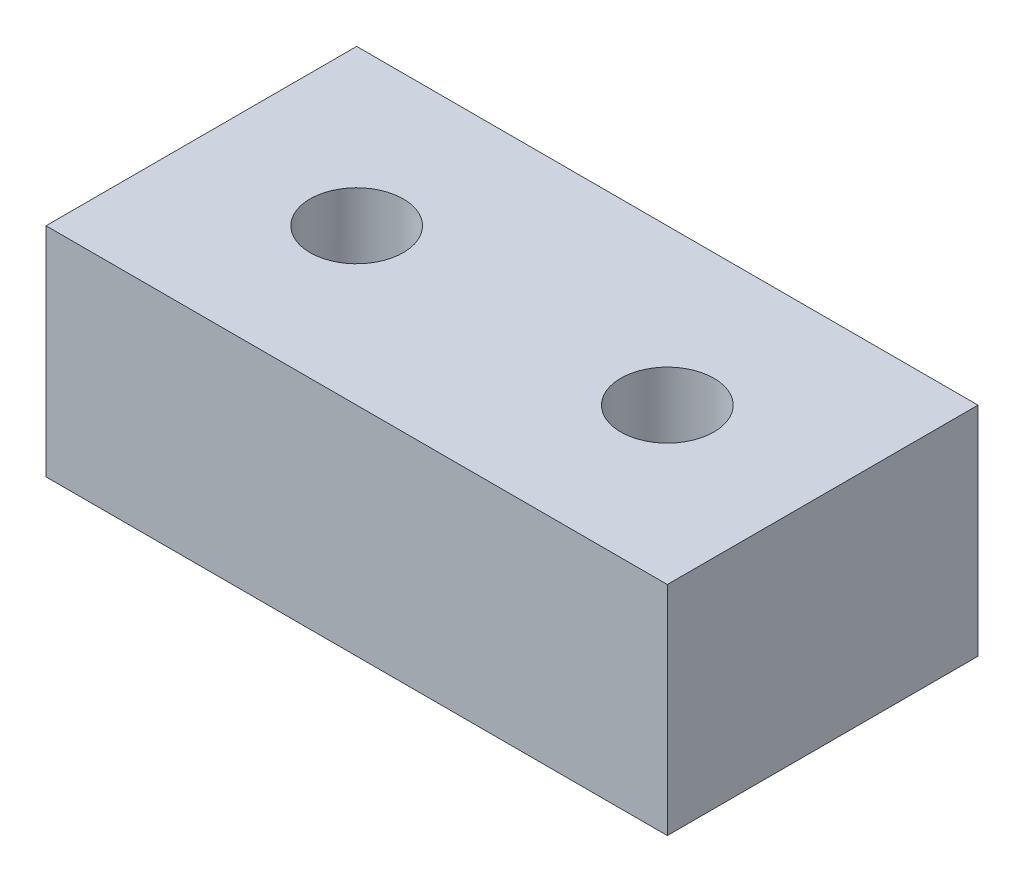
ISO-10303-21;
HEADER;
FILE_DESCRIPTION(('STEP AP214'),'2;1');
FILE_NAME('part.step','',(''),(''),'','','');
FILE_SCHEMA(('AUTOMOTIVE_DESIGN { 1 0 10303 214 1 1 1 1 }'));
ENDSEC;
DATA;
#1=APPLICATION_CONTEXT('core data for automotive mechanical design processes');
#2=APPLICATION_PROTOCOL_DEFINITION('international standard','automotive_design',2000,#1);
#3=PRODUCT_CONTEXT('',#1,'mechanical');
#4=PRODUCT('Part','Part','',(#3));
#5=PRODUCT_RELATED_PRODUCT_CATEGORY('part','',(#4));
#6=PRODUCT_DEFINITION_FORMATION('','',#4);
#7=PRODUCT_DEFINITION_CONTEXT('part definition',#1,'design');
#8=PRODUCT_DEFINITION('design','',#6,#7);
#9=PRODUCT_DEFINITION_SHAPE('','',#8);
#10=(LENGTH_UNIT() NAMED_UNIT(*) SI_UNIT(.MILLI.,.METRE.));
#11=(NAMED_UNIT(*) PLANE_ANGLE_UNIT() SI_UNIT($,.RADIAN.));
#12=(NAMED_UNIT(*) SI_UNIT($,.STERADIAN.) SOLID_ANGLE_UNIT());
#13=UNCERTAINTY_MEASURE_WITH_UNIT(LENGTH_MEASURE(1.E-05),#10,'distance_accuracy_value','');
#14=(GEOMETRIC_REPRESENTATION_CONTEXT(3) GLOBAL_UNCERTAINTY_ASSIGNED_CONTEXT((#13)) GLOBAL_UNIT_ASSIGNED_CONTEXT((#10,
#11,#12)) REPRESENTATION_CONTEXT('',''));
#15=CARTESIAN_POINT('',(0.,0.,0.));
#16=DIRECTION('',(0.,0.,1.));
#17=DIRECTION('',(1.,0.,0.));
#18=AXIS2_PLACEMENT_3D('',#15,#16,#17);
#19=CARTESIAN_POINT('',(10.,7.,5.));
#20=DIRECTION('',(-1.,0.,0.));
#21=DIRECTION('',(0.,0.,1.));
#22=AXIS2_PLACEMENT_3D('',#19,#20,#21);
#23=PLANE('',#22);
#24=DIRECTION('',(0.,0.,-1.));
#25=VECTOR('',#24,1.);
#26=CARTESIAN_POINT('',(10.,0.,5.));
#27=LINE('',#26,#25);
#28=CARTESIAN_POINT('',(10.,0.,5.));
#29=VERTEX_POINT('',#28);
#30=CARTESIAN_POINT('',(10.,0.,-5.));
#31=VERTEX_POINT('',#30);
#32=EDGE_CURVE('E108',#29,#31,#27,.T.);
#33=ORIENTED_EDGE('',*,*,#32,.T.);
#34=DIRECTION('',(0.,-1.,0.));
#35=VECTOR('',#34,1.);
#36=CARTESIAN_POINT('',(10.,7.,-5.));
#37=LINE('',#36,#35);
#38=CARTESIAN_POINT('',(10.,7.,-5.));
#39=VERTEX_POINT('',#38);
#40=EDGE_CURVE('E11',#39,#31,#37,.T.);
#41=ORIENTED_EDGE('',*,*,#40,.F.);
#42=DIRECTION('',(0.,0.,-1.));
#43=VECTOR('',#42,1.);
#44=CARTESIAN_POINT('',(10.,7.,5.));
#45=LINE('',#44,#43);
#46=CARTESIAN_POINT('',(10.,7.,5.));
#47=VERTEX_POINT('',#46);
#48=EDGE_CURVE('E95',#47,#39,#45,.T.);
#49=ORIENTED_EDGE('',*,*,#48,.F.);
#50=DIRECTION('',(0.,-1.,0.));
#51=VECTOR('',#50,1.);
#52=CARTESIAN_POINT('',(10.,7.,5.));
#53=LINE('',#52,#51);
#54=EDGE_CURVE('E104',#47,#29,#53,.T.);
#55=ORIENTED_EDGE('',*,*,#54,.T.);
#56=EDGE_LOOP('',(#33,#41,#49,#55));
#57=FACE_BOUND('',#56,.T.);
#58=ADVANCED_FACE('F42',(#57),#23,.F.);
#59=CARTESIAN_POINT('',(-10.,7.,-5.));
#60=DIRECTION('',(0.,0.,1.));
#61=DIRECTION('',(1.,0.,0.));
#62=AXIS2_PLACEMENT_3D('',#59,#60,#61);
#63=PLANE('',#62);
#64=DIRECTION('',(-1.,0.,0.));
#65=VECTOR('',#64,1.);
#66=CARTESIAN_POINT('',(-10.,0.,-5.));
#67=LINE('',#66,#65);
#68=CARTESIAN_POINT('',(-10.,0.,-5.));
#69=VERTEX_POINT('',#68);
#70=EDGE_CURVE('E99',#31,#69,#67,.T.);
#71=ORIENTED_EDGE('',*,*,#70,.T.);
#72=DIRECTION('',(0.,-1.,0.));
#73=VECTOR('',#72,1.);
#74=CARTESIAN_POINT('',(-10.,7.,-5.));
#75=LINE('',#74,#73);
#76=CARTESIAN_POINT('',(-10.,7.,-5.));
#77=VERTEX_POINT('',#76);
#78=EDGE_CURVE('E51',#77,#69,#75,.T.);
#79=ORIENTED_EDGE('',*,*,#78,.F.);
#80=DIRECTION('',(-1.,0.,0.));
#81=VECTOR('',#80,1.);
#82=CARTESIAN_POINT('',(-10.,7.,-5.));
#83=LINE('',#82,#81);
#84=EDGE_CURVE('E90',#39,#77,#83,.T.);
#85=ORIENTED_EDGE('',*,*,#84,.F.);
#86=ORIENTED_EDGE('',*,*,#40,.T.);
#87=EDGE_LOOP('',(#71,#79,#85,#86));
#88=FACE_BOUND('',#87,.T.);
#89=ADVANCED_FACE('F98',(#88),#63,.F.);
#90=CARTESIAN_POINT('',(-10.,7.,5.));
#91=DIRECTION('',(1.,0.,0.));
#92=DIRECTION('',(0.,0.,-1.));
#93=AXIS2_PLACEMENT_3D('',#90,#91,#92);
#94=PLANE('',#93);
#95=DIRECTION('',(0.,0.,1.));
#96=VECTOR('',#95,1.);
#97=CARTESIAN_POINT('',(-10.,0.,5.));
#98=LINE('',#97,#96);
#99=CARTESIAN_POINT('',(-10.,0.,5.));
#100=VERTEX_POINT('',#99);
#101=EDGE_CURVE('E77',#69,#100,#98,.T.);
#102=ORIENTED_EDGE('',*,*,#101,.T.);
#103=DIRECTION('',(0.,-1.,0.));
#104=VECTOR('',#103,1.);
#105=CARTESIAN_POINT('',(-10.,7.,5.));
#106=LINE('',#105,#104);
#107=CARTESIAN_POINT('',(-10.,7.,5.));
#108=VERTEX_POINT('',#107);
#109=EDGE_CURVE('E100',#108,#100,#106,.T.);
#110=ORIENTED_EDGE('',*,*,#109,.F.);
#111=DIRECTION('',(0.,0.,1.));
#112=VECTOR('',#111,1.);
#113=CARTESIAN_POINT('',(-10.,7.,5.));
#114=LINE('',#113,#112);
#115=EDGE_CURVE('E93',#77,#108,#114,.T.);
#116=ORIENTED_EDGE('',*,*,#115,.F.);
#117=ORIENTED_EDGE('',*,*,#78,.T.);
#118=EDGE_LOOP('',(#102,#110,#116,#117));
#119=FACE_BOUND('',#118,.T.);
#120=ADVANCED_FACE('F102',(#119),#94,.F.);
#121=CARTESIAN_POINT('',(-10.,7.,5.));
#122=DIRECTION('',(0.,0.,-1.));
#123=DIRECTION('',(-1.,0.,0.));
#124=AXIS2_PLACEMENT_3D('',#121,#122,#123);
#125=PLANE('',#124);
#126=DIRECTION('',(1.,0.,0.));
#127=VECTOR('',#126,1.);
#128=CARTESIAN_POINT('',(-10.,0.,5.));
#129=LINE('',#128,#127);
#130=EDGE_CURVE('E83',#100,#29,#129,.T.);
#131=ORIENTED_EDGE('',*,*,#130,.T.);
#132=ORIENTED_EDGE('',*,*,#54,.F.);
#133=DIRECTION('',(1.,0.,0.));
#134=VECTOR('',#133,1.);
#135=CARTESIAN_POINT('',(-10.,7.,5.));
#136=LINE('',#135,#134);
#137=EDGE_CURVE('E60',#108,#47,#136,.T.);
#138=ORIENTED_EDGE('',*,*,#137,.F.);
#139=ORIENTED_EDGE('',*,*,#109,.T.);
#140=EDGE_LOOP('',(#131,#132,#138,#139));
#141=FACE_BOUND('',#140,.T.);
#142=ADVANCED_FACE('F134',(#141),#125,.F.);
#143=CARTESIAN_POINT('',(0.,7.,0.));
#144=DIRECTION('',(0.,-1.,0.));
#145=DIRECTION('',(0.,0.,-1.));
#146=AXIS2_PLACEMENT_3D('',#143,#144,#145);
#147=PLANE('',#146);
#148=CARTESIAN_POINT('',(-5.,7.,0.));
#149=DIRECTION('',(0.,1.,0.));
#150=DIRECTION('',(0.,0.,1.));
#151=AXIS2_PLACEMENT_3D('',#148,#149,#150);
#152=CIRCLE('',#151,1.5);
#153=CARTESIAN_POINT('',(-5.,7.,1.5));
#154=VERTEX_POINT('',#153);
#155=EDGE_CURVE('E117',#154,#154,#152,.T.);
#156=ORIENTED_EDGE('',*,*,#155,.F.);
#157=EDGE_LOOP('',(#156));
#158=FACE_BOUND('',#157,.T.);
#159=CARTESIAN_POINT('',(5.,7.,0.));
#160=DIRECTION('',(0.,1.,0.));
#161=DIRECTION('',(0.,0.,-1.));
#162=AXIS2_PLACEMENT_3D('',#159,#160,#161);
#163=CIRCLE('',#162,1.5);
#164=CARTESIAN_POINT('',(5.,7.,-1.5));
#165=VERTEX_POINT('',#164);
#166=EDGE_CURVE('E122',#165,#165,#163,.T.);
#167=ORIENTED_EDGE('',*,*,#166,.F.);
#168=EDGE_LOOP('',(#167));
#169=FACE_BOUND('',#168,.T.);
#170=ORIENTED_EDGE('',*,*,#48,.T.);
#171=ORIENTED_EDGE('',*,*,#84,.T.);
#172=ORIENTED_EDGE('',*,*,#115,.T.);
#173=ORIENTED_EDGE('',*,*,#137,.T.);
#174=EDGE_LOOP('',(#170,#171,#172,#173));
#175=FACE_BOUND('',#174,.T.);
#176=ADVANCED_FACE('F91',(#158,#169,#175),#147,.F.);
#177=CARTESIAN_POINT('',(0.,0.,0.));
#178=DIRECTION('',(0.,-1.,0.));
#179=DIRECTION('',(0.,0.,-1.));
#180=AXIS2_PLACEMENT_3D('',#177,#178,#179);
#181=PLANE('',#180);
#182=CARTESIAN_POINT('',(-5.,0.,0.));
#183=DIRECTION('',(0.,-1.,0.));
#184=DIRECTION('',(0.,0.,-1.));
#185=AXIS2_PLACEMENT_3D('',#182,#183,#184);
#186=CIRCLE('',#185,1.5);
#187=CARTESIAN_POINT('',(-5.,0.,-1.5));
#188=VERTEX_POINT('',#187);
#189=EDGE_CURVE('E45',#188,#188,#186,.T.);
#190=ORIENTED_EDGE('',*,*,#189,.F.);
#191=EDGE_LOOP('',(#190));
#192=FACE_BOUND('',#191,.T.);
#193=CARTESIAN_POINT('',(5.,0.,0.));
#194=DIRECTION('',(0.,-1.,0.));
#195=DIRECTION('',(0.,0.,-1.));
#196=AXIS2_PLACEMENT_3D('',#193,#194,#195);
#197=CIRCLE('',#196,1.5);
#198=CARTESIAN_POINT('',(5.,0.,-1.5));
#199=VERTEX_POINT('',#198);
#200=EDGE_CURVE('E115',#199,#199,#197,.T.);
#201=ORIENTED_EDGE('',*,*,#200,.F.);
#202=EDGE_LOOP('',(#201));
#203=FACE_BOUND('',#202,.T.);
#204=ORIENTED_EDGE('',*,*,#32,.F.);
#205=ORIENTED_EDGE('',*,*,#130,.F.);
#206=ORIENTED_EDGE('',*,*,#101,.F.);
#207=ORIENTED_EDGE('',*,*,#70,.F.);
#208=EDGE_LOOP('',(#204,#205,#206,#207));
#209=FACE_BOUND('',#208,.T.);
#210=ADVANCED_FACE('F133',(#192,#203,#209),#181,.T.);
#211=CARTESIAN_POINT('',(5.,-3.,0.));
#212=DIRECTION('',(0.,1.,0.));
#213=DIRECTION('',(0.,0.,1.));
#214=AXIS2_PLACEMENT_3D('',#211,#212,#213);
#215=CYLINDRICAL_SURFACE('',#214,1.5);
#216=ORIENTED_EDGE('',*,*,#200,.T.);
#217=EDGE_LOOP('',(#216));
#218=FACE_BOUND('',#217,.T.);
#219=ORIENTED_EDGE('',*,*,#166,.T.);
#220=EDGE_LOOP('',(#219));
#221=FACE_BOUND('',#220,.T.);
#222=ADVANCED_FACE('F130',(#218,#221),#215,.F.);
#223=CARTESIAN_POINT('',(-5.,-3.,0.));
#224=DIRECTION('',(0.,1.,0.));
#225=DIRECTION('',(0.,0.,1.));
#226=AXIS2_PLACEMENT_3D('',#223,#224,#225);
#227=CYLINDRICAL_SURFACE('',#226,1.5);
#228=ORIENTED_EDGE('',*,*,#189,.T.);
#229=EDGE_LOOP('',(#228));
#230=FACE_BOUND('',#229,.T.);
#231=ORIENTED_EDGE('',*,*,#155,.T.);
#232=EDGE_LOOP('',(#231));
#233=FACE_BOUND('',#232,.T.);
#234=ADVANCED_FACE('F181',(#230,#233),#227,.F.);
#235=CLOSED_SHELL('',(#58,#89,#120,#142,#176,#210,#222,#234));
#236=MANIFOLD_SOLID_BREP('B2',#235);
#237=ADVANCED_BREP_SHAPE_REPRESENTATION('',(#18,#236),#14);
#238=SHAPE_DEFINITION_REPRESENTATION(#9,#237);
ENDSEC;
END-ISO-10303-21;
